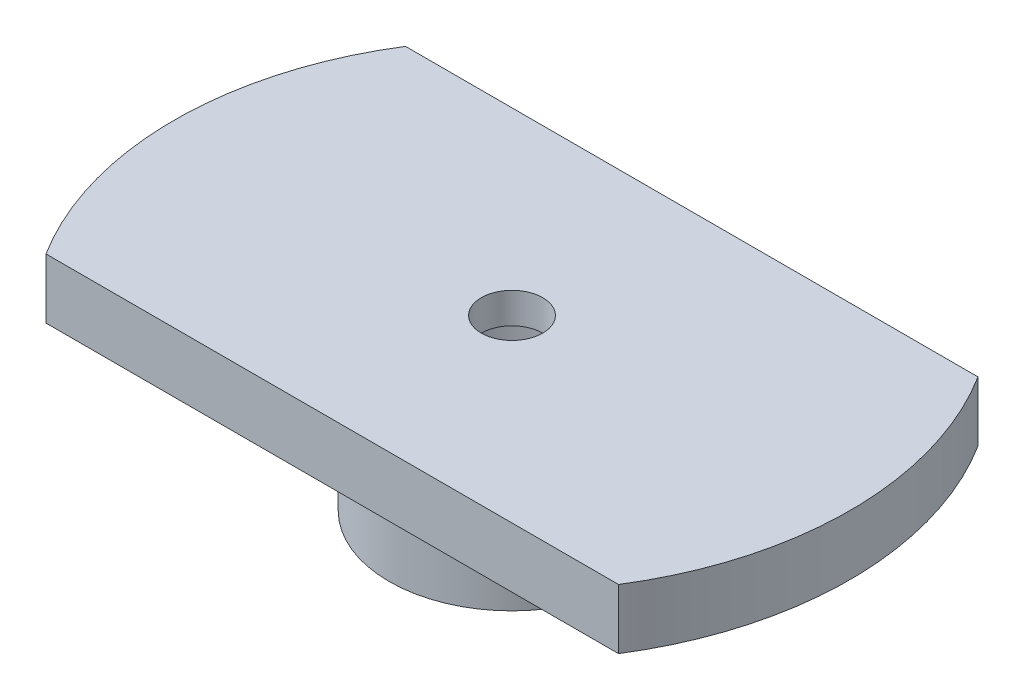
ISO-10303-21;
HEADER;
FILE_DESCRIPTION(('STEP AP214'),'2;1');
FILE_NAME('part.step','',(''),(''),'','','');
FILE_SCHEMA(('AUTOMOTIVE_DESIGN { 1 0 10303 214 1 1 1 1 }'));
ENDSEC;
DATA;
#1=APPLICATION_CONTEXT('core data for automotive mechanical design processes');
#2=APPLICATION_PROTOCOL_DEFINITION('international standard','automotive_design',2000,#1);
#3=PRODUCT_CONTEXT('',#1,'mechanical');
#4=PRODUCT('Part','Part','',(#3));
#5=PRODUCT_RELATED_PRODUCT_CATEGORY('part','',(#4));
#6=PRODUCT_DEFINITION_FORMATION('','',#4);
#7=PRODUCT_DEFINITION_CONTEXT('part definition',#1,'design');
#8=PRODUCT_DEFINITION('design','',#6,#7);
#9=PRODUCT_DEFINITION_SHAPE('','',#8);
#10=(LENGTH_UNIT() NAMED_UNIT(*) SI_UNIT(.MILLI.,.METRE.));
#11=(NAMED_UNIT(*) PLANE_ANGLE_UNIT() SI_UNIT($,.RADIAN.));
#12=(NAMED_UNIT(*) SI_UNIT($,.STERADIAN.) SOLID_ANGLE_UNIT());
#13=UNCERTAINTY_MEASURE_WITH_UNIT(LENGTH_MEASURE(1.E-05),#10,'distance_accuracy_value','');
#14=(GEOMETRIC_REPRESENTATION_CONTEXT(3) GLOBAL_UNCERTAINTY_ASSIGNED_CONTEXT((#13)) GLOBAL_UNIT_ASSIGNED_CONTEXT((#10,
#11,#12)) REPRESENTATION_CONTEXT('',''));
#15=CARTESIAN_POINT('',(0.,0.,0.));
#16=DIRECTION('',(0.,0.,1.));
#17=DIRECTION('',(1.,0.,0.));
#18=AXIS2_PLACEMENT_3D('',#15,#16,#17);
#19=CARTESIAN_POINT('',(17.,-1.95,-5.85000000000001));
#20=DIRECTION('',(0.,0.,-1.));
#21=DIRECTION('',(-1.,0.,0.));
#22=AXIS2_PLACEMENT_3D('',#19,#20,#21);
#23=PLANE('',#22);
#24=DIRECTION('',(-1.,0.,0.));
#25=VECTOR('',#24,1.);
#26=CARTESIAN_POINT('',(17.,-1.95,-5.85000000000001));
#27=LINE('',#26,#25);
#28=CARTESIAN_POINT('',(9.31544416547058,-1.95,-5.85));
#29=VERTEX_POINT('',#28);
#30=CARTESIAN_POINT('',(-9.31544416547058,-1.95,-5.85));
#31=VERTEX_POINT('',#30);
#32=EDGE_CURVE('E86',#29,#31,#27,.T.);
#33=ORIENTED_EDGE('',*,*,#32,.T.);
#34=DIRECTION('',(0.,1.,0.));
#35=VECTOR('',#34,1.);
#36=CARTESIAN_POINT('',(-9.31544416547058,-5.5,-5.85));
#37=LINE('',#36,#35);
#38=CARTESIAN_POINT('',(-9.31544416547058,0.,-5.85));
#39=VERTEX_POINT('',#38);
#40=EDGE_CURVE('E74',#31,#39,#37,.T.);
#41=ORIENTED_EDGE('',*,*,#40,.T.);
#42=DIRECTION('',(-1.,0.,0.));
#43=VECTOR('',#42,1.);
#44=CARTESIAN_POINT('',(17.,0.,-5.85000000000001));
#45=LINE('',#44,#43);
#46=CARTESIAN_POINT('',(9.31544416547058,0.,-5.85));
#47=VERTEX_POINT('',#46);
#48=EDGE_CURVE('E84',#47,#39,#45,.T.);
#49=ORIENTED_EDGE('',*,*,#48,.F.);
#50=DIRECTION('',(0.,1.,0.));
#51=VECTOR('',#50,1.);
#52=CARTESIAN_POINT('',(9.31544416547058,-5.5,-5.85));
#53=LINE('',#52,#51);
#54=EDGE_CURVE('E58',#47,#29,#53,.F.);
#55=ORIENTED_EDGE('',*,*,#54,.T.);
#56=EDGE_LOOP('',(#33,#41,#49,#55));
#57=FACE_BOUND('',#56,.T.);
#58=ADVANCED_FACE('F35',(#57),#23,.T.);
#59=CARTESIAN_POINT('',(17.,-1.95,5.85000000000001));
#60=DIRECTION('',(0.,0.,1.));
#61=DIRECTION('',(1.,0.,0.));
#62=AXIS2_PLACEMENT_3D('',#59,#60,#61);
#63=PLANE('',#62);
#64=DIRECTION('',(1.,0.,0.));
#65=VECTOR('',#64,1.);
#66=CARTESIAN_POINT('',(17.,-1.95,5.85000000000001));
#67=LINE('',#66,#65);
#68=CARTESIAN_POINT('',(-9.31544416547058,-1.95,5.85));
#69=VERTEX_POINT('',#68);
#70=CARTESIAN_POINT('',(9.31544416547058,-1.95,5.85));
#71=VERTEX_POINT('',#70);
#72=EDGE_CURVE('E90',#69,#71,#67,.T.);
#73=ORIENTED_EDGE('',*,*,#72,.T.);
#74=DIRECTION('',(0.,1.,0.));
#75=VECTOR('',#74,1.);
#76=CARTESIAN_POINT('',(9.31544416547058,-5.5,5.85));
#77=LINE('',#76,#75);
#78=CARTESIAN_POINT('',(9.31544416547058,0.,5.85));
#79=VERTEX_POINT('',#78);
#80=EDGE_CURVE('E118',#71,#79,#77,.T.);
#81=ORIENTED_EDGE('',*,*,#80,.T.);
#82=DIRECTION('',(1.,0.,0.));
#83=VECTOR('',#82,1.);
#84=CARTESIAN_POINT('',(17.,0.,5.85000000000001));
#85=LINE('',#84,#83);
#86=CARTESIAN_POINT('',(-9.31544416547058,0.,5.85));
#87=VERTEX_POINT('',#86);
#88=EDGE_CURVE('E91',#87,#79,#85,.T.);
#89=ORIENTED_EDGE('',*,*,#88,.F.);
#90=DIRECTION('',(0.,1.,0.));
#91=VECTOR('',#90,1.);
#92=CARTESIAN_POINT('',(-9.31544416547058,-5.5,5.85));
#93=LINE('',#92,#91);
#94=EDGE_CURVE('E50',#87,#69,#93,.F.);
#95=ORIENTED_EDGE('',*,*,#94,.T.);
#96=EDGE_LOOP('',(#73,#81,#89,#95));
#97=FACE_BOUND('',#96,.T.);
#98=ADVANCED_FACE('F37',(#97),#63,.T.);
#99=CARTESIAN_POINT('',(-17.,-1.95,0.));
#100=DIRECTION('',(0.,1.,0.));
#101=DIRECTION('',(0.,0.,1.));
#102=AXIS2_PLACEMENT_3D('',#99,#100,#101);
#103=PLANE('',#102);
#104=CARTESIAN_POINT('',(0.,-1.95,0.));
#105=DIRECTION('',(0.,1.,0.));
#106=DIRECTION('',(0.,0.,1.));
#107=AXIS2_PLACEMENT_3D('',#104,#105,#106);
#108=CIRCLE('',#107,4.);
#109=CARTESIAN_POINT('',(0.,-1.95,4.));
#110=VERTEX_POINT('',#109);
#111=EDGE_CURVE('E80',#110,#110,#108,.F.);
#112=ORIENTED_EDGE('',*,*,#111,.F.);
#113=EDGE_LOOP('',(#112));
#114=FACE_BOUND('',#113,.T.);
#115=CARTESIAN_POINT('',(0.,-1.95,0.));
#116=DIRECTION('',(0.,1.,0.));
#117=DIRECTION('',(0.,0.,1.));
#118=AXIS2_PLACEMENT_3D('',#115,#116,#117);
#119=CIRCLE('',#118,11.);
#120=EDGE_CURVE('E116',#71,#29,#119,.T.);
#121=ORIENTED_EDGE('',*,*,#120,.F.);
#122=ORIENTED_EDGE('',*,*,#72,.F.);
#123=EDGE_CURVE('E87',#31,#69,#119,.T.);
#124=ORIENTED_EDGE('',*,*,#123,.F.);
#125=ORIENTED_EDGE('',*,*,#32,.F.);
#126=EDGE_LOOP('',(#121,#122,#124,#125));
#127=FACE_BOUND('',#126,.T.);
#128=ADVANCED_FACE('F126',(#114,#127),#103,.F.);
#129=CARTESIAN_POINT('',(-17.,0.,0.));
#130=DIRECTION('',(0.,1.,0.));
#131=DIRECTION('',(0.,0.,1.));
#132=AXIS2_PLACEMENT_3D('',#129,#130,#131);
#133=PLANE('',#132);
#134=CARTESIAN_POINT('',(0.,0.,0.));
#135=DIRECTION('',(0.,1.,0.));
#136=DIRECTION('',(0.,0.,1.));
#137=AXIS2_PLACEMENT_3D('',#134,#135,#136);
#138=CIRCLE('',#137,1.);
#139=CARTESIAN_POINT('',(0.,0.,1.));
#140=VERTEX_POINT('',#139);
#141=EDGE_CURVE('E108',#140,#140,#138,.F.);
#142=ORIENTED_EDGE('',*,*,#141,.T.);
#143=EDGE_LOOP('',(#142));
#144=FACE_BOUND('',#143,.T.);
#145=ORIENTED_EDGE('',*,*,#88,.T.);
#146=CARTESIAN_POINT('',(0.,0.,0.));
#147=DIRECTION('',(0.,1.,0.));
#148=DIRECTION('',(0.,0.,1.));
#149=AXIS2_PLACEMENT_3D('',#146,#147,#148);
#150=CIRCLE('',#149,11.);
#151=EDGE_CURVE('E12',#79,#47,#150,.T.);
#152=ORIENTED_EDGE('',*,*,#151,.T.);
#153=ORIENTED_EDGE('',*,*,#48,.T.);
#154=EDGE_CURVE('E39',#39,#87,#150,.T.);
#155=ORIENTED_EDGE('',*,*,#154,.T.);
#156=EDGE_LOOP('',(#145,#152,#153,#155));
#157=FACE_BOUND('',#156,.T.);
#158=ADVANCED_FACE('F89',(#144,#157),#133,.T.);
#159=CARTESIAN_POINT('',(0.,-5.5,0.));
#160=DIRECTION('',(0.,1.,0.));
#161=DIRECTION('',(0.,0.,1.));
#162=AXIS2_PLACEMENT_3D('',#159,#160,#161);
#163=CYLINDRICAL_SURFACE('',#162,4.);
#164=CARTESIAN_POINT('',(0.,-5.5,0.));
#165=DIRECTION('',(0.,-1.,0.));
#166=DIRECTION('',(0.,0.,-1.));
#167=AXIS2_PLACEMENT_3D('',#164,#165,#166);
#168=CIRCLE('',#167,4.);
#169=CARTESIAN_POINT('',(0.,-5.5,-4.));
#170=VERTEX_POINT('',#169);
#171=EDGE_CURVE('E95',#170,#170,#168,.T.);
#172=ORIENTED_EDGE('',*,*,#171,.F.);
#173=EDGE_LOOP('',(#172));
#174=FACE_BOUND('',#173,.T.);
#175=ORIENTED_EDGE('',*,*,#111,.T.);
#176=EDGE_LOOP('',(#175));
#177=FACE_BOUND('',#176,.T.);
#178=ADVANCED_FACE('F142',(#174,#177),#163,.T.);
#179=CARTESIAN_POINT('',(0.,-5.5,0.));
#180=DIRECTION('',(0.,-1.,0.));
#181=DIRECTION('',(0.,0.,-1.));
#182=AXIS2_PLACEMENT_3D('',#179,#180,#181);
#183=PLANE('',#182);
#184=CARTESIAN_POINT('',(0.,-5.5,0.));
#185=DIRECTION('',(0.,-1.,0.));
#186=DIRECTION('',(0.,0.,-1.));
#187=AXIS2_PLACEMENT_3D('',#184,#185,#186);
#188=CIRCLE('',#187,2.86);
#189=CARTESIAN_POINT('',(0.,-5.5,-2.86));
#190=VERTEX_POINT('',#189);
#191=EDGE_CURVE('E105',#190,#190,#188,.T.);
#192=ORIENTED_EDGE('',*,*,#191,.F.);
#193=EDGE_LOOP('',(#192));
#194=FACE_BOUND('',#193,.T.);
#195=ORIENTED_EDGE('',*,*,#171,.T.);
#196=EDGE_LOOP('',(#195));
#197=FACE_BOUND('',#196,.T.);
#198=ADVANCED_FACE('F149',(#194,#197),#183,.T.);
#199=CARTESIAN_POINT('',(0.,-1.,0.));
#200=DIRECTION('',(0.,-1.,0.));
#201=DIRECTION('',(0.,0.,-1.));
#202=AXIS2_PLACEMENT_3D('',#199,#200,#201);
#203=CYLINDRICAL_SURFACE('',#202,2.86);
#204=CARTESIAN_POINT('',(0.,-1.,0.));
#205=DIRECTION('',(0.,-1.,0.));
#206=DIRECTION('',(0.,0.,-1.));
#207=AXIS2_PLACEMENT_3D('',#204,#205,#206);
#208=CIRCLE('',#207,2.86);
#209=CARTESIAN_POINT('',(0.,-1.,-2.86));
#210=VERTEX_POINT('',#209);
#211=EDGE_CURVE('E104',#210,#210,#208,.T.);
#212=ORIENTED_EDGE('',*,*,#211,.F.);
#213=EDGE_LOOP('',(#212));
#214=FACE_BOUND('',#213,.T.);
#215=ORIENTED_EDGE('',*,*,#191,.T.);
#216=EDGE_LOOP('',(#215));
#217=FACE_BOUND('',#216,.T.);
#218=ADVANCED_FACE('F153',(#214,#217),#203,.F.);
#219=CARTESIAN_POINT('',(0.,-1.,0.));
#220=DIRECTION('',(0.,-1.,0.));
#221=DIRECTION('',(0.,0.,-1.));
#222=AXIS2_PLACEMENT_3D('',#219,#220,#221);
#223=PLANE('',#222);
#224=CARTESIAN_POINT('',(0.,-1.,0.));
#225=DIRECTION('',(0.,-1.,0.));
#226=DIRECTION('',(0.,0.,-1.));
#227=AXIS2_PLACEMENT_3D('',#224,#225,#226);
#228=CIRCLE('',#227,1.);
#229=CARTESIAN_POINT('',(0.,-1.,-1.));
#230=VERTEX_POINT('',#229);
#231=EDGE_CURVE('E113',#230,#230,#228,.T.);
#232=ORIENTED_EDGE('',*,*,#231,.F.);
#233=EDGE_LOOP('',(#232));
#234=FACE_BOUND('',#233,.T.);
#235=ORIENTED_EDGE('',*,*,#211,.T.);
#236=EDGE_LOOP('',(#235));
#237=FACE_BOUND('',#236,.T.);
#238=ADVANCED_FACE('F157',(#234,#237),#223,.T.);
#239=CARTESIAN_POINT('',(0.,2.82842712474619,0.));
#240=DIRECTION('',(0.,-1.,0.));
#241=DIRECTION('',(0.,0.,-1.));
#242=AXIS2_PLACEMENT_3D('',#239,#240,#241);
#243=CYLINDRICAL_SURFACE('',#242,1.);
#244=ORIENTED_EDGE('',*,*,#231,.T.);
#245=EDGE_LOOP('',(#244));
#246=FACE_BOUND('',#245,.T.);
#247=ORIENTED_EDGE('',*,*,#141,.F.);
#248=EDGE_LOOP('',(#247));
#249=FACE_BOUND('',#248,.T.);
#250=ADVANCED_FACE('F133',(#246,#249),#243,.F.);
#251=CARTESIAN_POINT('',(0.,-5.5,0.));
#252=DIRECTION('',(0.,1.,0.));
#253=DIRECTION('',(0.,0.,1.));
#254=AXIS2_PLACEMENT_3D('',#251,#252,#253);
#255=CYLINDRICAL_SURFACE('',#254,11.);
#256=ORIENTED_EDGE('',*,*,#123,.T.);
#257=ORIENTED_EDGE('',*,*,#94,.F.);
#258=ORIENTED_EDGE('',*,*,#154,.F.);
#259=ORIENTED_EDGE('',*,*,#40,.F.);
#260=EDGE_LOOP('',(#256,#257,#258,#259));
#261=FACE_BOUND('',#260,.T.);
#262=ADVANCED_FACE('F73',(#261),#255,.T.);
#263=ORIENTED_EDGE('',*,*,#120,.T.);
#264=ORIENTED_EDGE('',*,*,#54,.F.);
#265=ORIENTED_EDGE('',*,*,#151,.F.);
#266=ORIENTED_EDGE('',*,*,#80,.F.);
#267=EDGE_LOOP('',(#263,#264,#265,#266));
#268=FACE_BOUND('',#267,.T.);
#269=ADVANCED_FACE('F127',(#268),#255,.T.);
#270=CLOSED_SHELL('',(#58,#98,#128,#158,#178,#198,#218,#238,#250,#262,#269));
#271=MANIFOLD_SOLID_BREP('B2',#270);
#272=ADVANCED_BREP_SHAPE_REPRESENTATION('',(#18,#271),#14);
#273=SHAPE_DEFINITION_REPRESENTATION(#9,#272);
ENDSEC;
END-ISO-10303-21;
